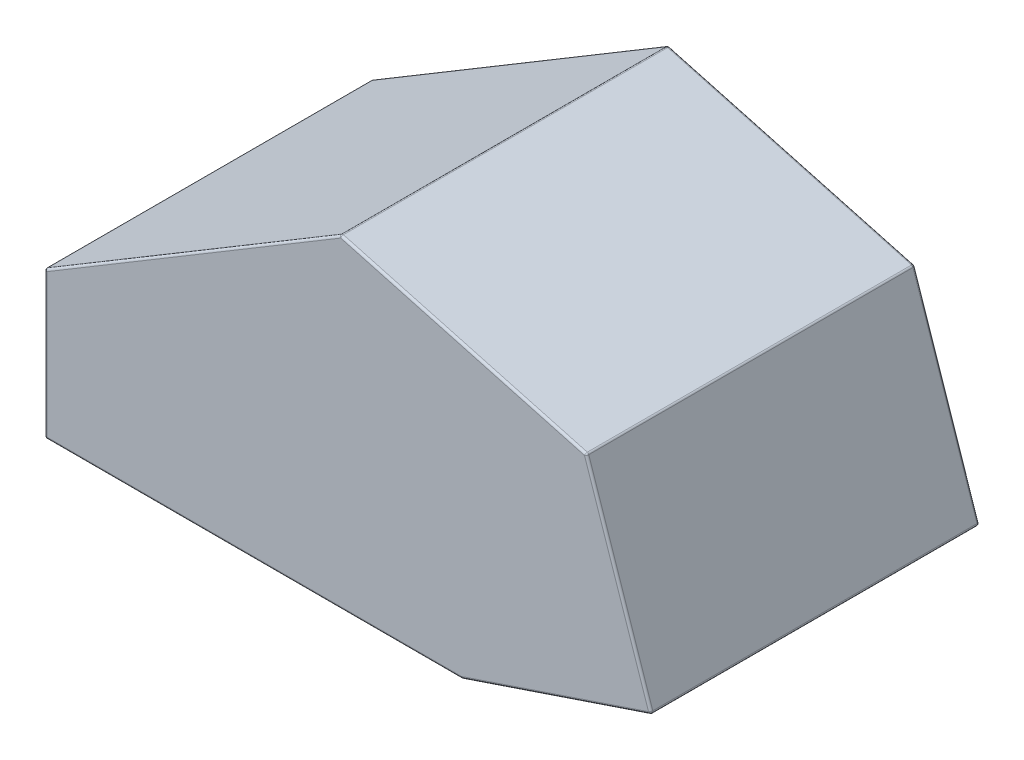
ISO-10303-21;
HEADER;
FILE_DESCRIPTION(('STEP AP214'),'2;1');
FILE_NAME('part.step','',(''),(''),'','','');
FILE_SCHEMA(('AUTOMOTIVE_DESIGN { 1 0 10303 214 1 1 1 1 }'));
ENDSEC;
DATA;
#1=APPLICATION_CONTEXT('core data for automotive mechanical design processes');
#2=APPLICATION_PROTOCOL_DEFINITION('international standard','automotive_design',2000,#1);
#3=PRODUCT_CONTEXT('',#1,'mechanical');
#4=PRODUCT('Part','Part','',(#3));
#5=PRODUCT_RELATED_PRODUCT_CATEGORY('part','',(#4));
#6=PRODUCT_DEFINITION_FORMATION('','',#4);
#7=PRODUCT_DEFINITION_CONTEXT('part definition',#1,'design');
#8=PRODUCT_DEFINITION('design','',#6,#7);
#9=PRODUCT_DEFINITION_SHAPE('','',#8);
#10=(LENGTH_UNIT() NAMED_UNIT(*) SI_UNIT(.MILLI.,.METRE.));
#11=(NAMED_UNIT(*) PLANE_ANGLE_UNIT() SI_UNIT($,.RADIAN.));
#12=(NAMED_UNIT(*) SI_UNIT($,.STERADIAN.) SOLID_ANGLE_UNIT());
#13=UNCERTAINTY_MEASURE_WITH_UNIT(LENGTH_MEASURE(1.E-05),#10,'distance_accuracy_value','');
#14=(GEOMETRIC_REPRESENTATION_CONTEXT(3) GLOBAL_UNCERTAINTY_ASSIGNED_CONTEXT((#13)) GLOBAL_UNIT_ASSIGNED_CONTEXT((#10,
#11,#12)) REPRESENTATION_CONTEXT('',''));
#15=CARTESIAN_POINT('',(0.,0.,0.));
#16=DIRECTION('',(0.,0.,1.));
#17=DIRECTION('',(1.,0.,0.));
#18=AXIS2_PLACEMENT_3D('',#15,#16,#17);
#19=CARTESIAN_POINT('',(424.852995024936,246.325755666636,-19.05));
#20=DIRECTION('',(0.947600978560582,0.31945639049959,0.));
#21=DIRECTION('',(-0.31945639049959,0.947600978560582,0.));
#22=AXIS2_PLACEMENT_3D('',#19,#20,#21);
#23=PLANE('',#22);
#24=DIRECTION('',(0.,0.,1.));
#25=VECTOR('',#24,1.);
#26=CARTESIAN_POINT('',(424.771853101749,246.56644631519,-19.05));
#27=LINE('',#26,#25);
#28=CARTESIAN_POINT('',(424.771853101749,246.56644631519,18.796));
#29=VERTEX_POINT('',#28);
#30=CARTESIAN_POINT('',(424.771853101749,246.56644631519,-18.796));
#31=VERTEX_POINT('',#30);
#32=EDGE_CURVE('E188',#29,#31,#27,.F.);
#33=ORIENTED_EDGE('',*,*,#32,.T.);
#34=DIRECTION('',(-0.31945639049959,0.947600978560582,0.));
#35=VECTOR('',#34,1.);
#36=CARTESIAN_POINT('',(424.852995024936,246.325755666636,-18.796));
#37=LINE('',#36,#35);
#38=CARTESIAN_POINT('',(417.351853621064,268.5763324152,-18.796));
#39=VERTEX_POINT('',#38);
#40=EDGE_CURVE('E162',#31,#39,#37,.T.);
#41=ORIENTED_EDGE('',*,*,#40,.T.);
#42=DIRECTION('',(0.,0.,1.));
#43=VECTOR('',#42,1.);
#44=CARTESIAN_POINT('',(417.351853621064,268.5763324152,-19.05));
#45=LINE('',#44,#43);
#46=CARTESIAN_POINT('',(417.351853621064,268.5763324152,18.796));
#47=VERTEX_POINT('',#46);
#48=EDGE_CURVE('E179',#39,#47,#45,.T.);
#49=ORIENTED_EDGE('',*,*,#48,.T.);
#50=DIRECTION('',(-0.31945639049959,0.947600978560582,0.));
#51=VECTOR('',#50,1.);
#52=CARTESIAN_POINT('',(424.852995024936,246.325755666636,18.796));
#53=LINE('',#52,#51);
#54=EDGE_CURVE('E185',#47,#29,#53,.F.);
#55=ORIENTED_EDGE('',*,*,#54,.T.);
#56=EDGE_LOOP('',(#33,#41,#49,#55));
#57=FACE_BOUND('',#56,.T.);
#58=ADVANCED_FACE('F33',(#57),#23,.T.);
#59=CARTESIAN_POINT('',(402.896942525742,238.923904634711,-19.05));
#60=DIRECTION('',(0.319456390499589,-0.947600978560583,0.));
#61=DIRECTION('',(0.947600978560583,0.31945639049959,0.));
#62=AXIS2_PLACEMENT_3D('',#59,#60,#61);
#63=PLANE('',#62);
#64=DIRECTION('',(0.947600978560583,0.31945639049959,0.));
#65=VECTOR('',#64,1.);
#66=CARTESIAN_POINT('',(402.896942525742,238.923904634711,-18.796));
#67=LINE('',#66,#65);
#68=CARTESIAN_POINT('',(402.936421950255,238.937213986156,-18.796));
#69=VERTEX_POINT('',#68);
#70=CARTESIAN_POINT('',(424.612304376382,246.244613743449,-18.796));
#71=VERTEX_POINT('',#70);
#72=EDGE_CURVE('E205',#69,#71,#67,.T.);
#73=ORIENTED_EDGE('',*,*,#72,.T.);
#74=DIRECTION('',(0.,0.,1.));
#75=VECTOR('',#74,1.);
#76=CARTESIAN_POINT('',(424.612304376382,246.244613743449,-19.05));
#77=LINE('',#76,#75);
#78=CARTESIAN_POINT('',(424.612304376382,246.244613743449,18.796));
#79=VERTEX_POINT('',#78);
#80=EDGE_CURVE('E211',#71,#79,#77,.T.);
#81=ORIENTED_EDGE('',*,*,#80,.T.);
#82=DIRECTION('',(0.947600978560583,0.31945639049959,0.));
#83=VECTOR('',#82,1.);
#84=CARTESIAN_POINT('',(402.896942525742,238.923904634711,18.796));
#85=LINE('',#84,#83);
#86=CARTESIAN_POINT('',(402.936421950255,238.937213986156,18.796));
#87=VERTEX_POINT('',#86);
#88=EDGE_CURVE('E209',#79,#87,#85,.F.);
#89=ORIENTED_EDGE('',*,*,#88,.T.);
#90=DIRECTION('',(0.,0.,1.));
#91=VECTOR('',#90,1.);
#92=CARTESIAN_POINT('',(402.936421950255,238.937213986156,-19.05));
#93=LINE('',#92,#91);
#94=EDGE_CURVE('E207',#87,#69,#93,.F.);
#95=ORIENTED_EDGE('',*,*,#94,.T.);
#96=EDGE_LOOP('',(#73,#81,#89,#95));
#97=FACE_BOUND('',#96,.T.);
#98=ADVANCED_FACE('F456',(#97),#63,.T.);
#99=CARTESIAN_POINT('',(354.511506684143,238.923904634711,-19.05));
#100=DIRECTION('',(0.,-1.,0.));
#101=DIRECTION('',(0.,0.,-1.));
#102=AXIS2_PLACEMENT_3D('',#99,#100,#101);
#103=PLANE('',#102);
#104=DIRECTION('',(1.,0.,0.));
#105=VECTOR('',#104,1.);
#106=CARTESIAN_POINT('',(354.511506684143,238.923904634711,18.796));
#107=LINE('',#106,#105);
#108=CARTESIAN_POINT('',(402.855280027068,238.923904634711,18.796));
#109=VERTEX_POINT('',#108);
#110=CARTESIAN_POINT('',(354.765506684143,238.923904634711,18.796));
#111=VERTEX_POINT('',#110);
#112=EDGE_CURVE('E227',#109,#111,#107,.F.);
#113=ORIENTED_EDGE('',*,*,#112,.T.);
#114=DIRECTION('',(0.,0.,1.));
#115=VECTOR('',#114,1.);
#116=CARTESIAN_POINT('',(354.765506684143,238.923904634711,-19.05));
#117=LINE('',#116,#115);
#118=CARTESIAN_POINT('',(354.765506684143,238.923904634711,-18.796));
#119=VERTEX_POINT('',#118);
#120=EDGE_CURVE('E229',#111,#119,#117,.F.);
#121=ORIENTED_EDGE('',*,*,#120,.T.);
#122=DIRECTION('',(1.,0.,0.));
#123=VECTOR('',#122,1.);
#124=CARTESIAN_POINT('',(354.511506684143,238.923904634711,-18.796));
#125=LINE('',#124,#123);
#126=CARTESIAN_POINT('',(402.855280027068,238.923904634711,-18.796));
#127=VERTEX_POINT('',#126);
#128=EDGE_CURVE('E223',#119,#127,#125,.T.);
#129=ORIENTED_EDGE('',*,*,#128,.T.);
#130=DIRECTION('',(0.,0.,1.));
#131=VECTOR('',#130,1.);
#132=CARTESIAN_POINT('',(402.855280027068,238.923904634711,-19.05));
#133=LINE('',#132,#131);
#134=EDGE_CURVE('E225',#127,#109,#133,.T.);
#135=ORIENTED_EDGE('',*,*,#134,.T.);
#136=EDGE_LOOP('',(#113,#121,#129,#135));
#137=FACE_BOUND('',#136,.T.);
#138=ADVANCED_FACE('F363',(#137),#103,.T.);
#139=CARTESIAN_POINT('',(354.511506684143,255.928673381803,-19.05));
#140=DIRECTION('',(-1.,0.,0.));
#141=DIRECTION('',(0.,0.,1.));
#142=AXIS2_PLACEMENT_3D('',#139,#140,#141);
#143=PLANE('',#142);
#144=DIRECTION('',(0.,0.,1.));
#145=VECTOR('',#144,1.);
#146=CARTESIAN_POINT('',(354.511506684143,255.784738849906,-19.05));
#147=LINE('',#146,#145);
#148=CARTESIAN_POINT('',(354.511506684143,255.784738849906,18.796));
#149=VERTEX_POINT('',#148);
#150=CARTESIAN_POINT('',(354.511506684143,255.784738849906,-18.796));
#151=VERTEX_POINT('',#150);
#152=EDGE_CURVE('E216',#149,#151,#147,.F.);
#153=ORIENTED_EDGE('',*,*,#152,.T.);
#154=DIRECTION('',(0.,-1.,0.));
#155=VECTOR('',#154,1.);
#156=CARTESIAN_POINT('',(354.511506684143,255.928673381803,-18.796));
#157=LINE('',#156,#155);
#158=CARTESIAN_POINT('',(354.511506684143,239.177904634711,-18.796));
#159=VERTEX_POINT('',#158);
#160=EDGE_CURVE('E220',#151,#159,#157,.T.);
#161=ORIENTED_EDGE('',*,*,#160,.T.);
#162=DIRECTION('',(0.,0.,1.));
#163=VECTOR('',#162,1.);
#164=CARTESIAN_POINT('',(354.511506684143,239.177904634711,-19.05));
#165=LINE('',#164,#163);
#166=CARTESIAN_POINT('',(354.511506684143,239.177904634711,18.796));
#167=VERTEX_POINT('',#166);
#168=EDGE_CURVE('E218',#159,#167,#165,.T.);
#169=ORIENTED_EDGE('',*,*,#168,.T.);
#170=DIRECTION('',(0.,-1.,0.));
#171=VECTOR('',#170,1.);
#172=CARTESIAN_POINT('',(354.511506684143,255.928673381803,18.796));
#173=LINE('',#172,#171);
#174=EDGE_CURVE('E214',#167,#149,#173,.F.);
#175=ORIENTED_EDGE('',*,*,#174,.T.);
#176=EDGE_LOOP('',(#153,#161,#169,#175));
#177=FACE_BOUND('',#176,.T.);
#178=ADVANCED_FACE('F383',(#177),#143,.T.);
#179=CARTESIAN_POINT('',(388.793340161436,276.463831058795,-19.05));
#180=DIRECTION('',(-0.513871079491551,0.857867421961102,0.));
#181=DIRECTION('',(-0.857867421961102,-0.513871079491551,0.));
#182=AXIS2_PLACEMENT_3D('',#179,#180,#181);
#183=PLANE('',#182);
#184=DIRECTION('',(0.,0.,1.));
#185=VECTOR('',#184,1.);
#186=CARTESIAN_POINT('',(388.70052465153,276.408233649396,-19.05));
#187=LINE('',#186,#185);
#188=CARTESIAN_POINT('',(388.70052465153,276.408233649396,18.796));
#189=VERTEX_POINT('',#188);
#190=CARTESIAN_POINT('',(388.70052465153,276.408233649396,-18.796));
#191=VERTEX_POINT('',#190);
#192=EDGE_CURVE('E232',#189,#191,#187,.F.);
#193=ORIENTED_EDGE('',*,*,#192,.T.);
#194=DIRECTION('',(-0.857867421961102,-0.513871079491551,0.));
#195=VECTOR('',#194,1.);
#196=CARTESIAN_POINT('',(388.793340161436,276.463831058795,-18.796));
#197=LINE('',#196,#195);
#198=CARTESIAN_POINT('',(354.634983429952,256.002637175084,-18.796));
#199=VERTEX_POINT('',#198);
#200=EDGE_CURVE('E238',#191,#199,#197,.T.);
#201=ORIENTED_EDGE('',*,*,#200,.T.);
#202=DIRECTION('',(0.,0.,1.));
#203=VECTOR('',#202,1.);
#204=CARTESIAN_POINT('',(354.634983429952,256.002637175084,-19.05));
#205=LINE('',#204,#203);
#206=CARTESIAN_POINT('',(354.634983429952,256.002637175084,18.796));
#207=VERTEX_POINT('',#206);
#208=EDGE_CURVE('E236',#199,#207,#205,.T.);
#209=ORIENTED_EDGE('',*,*,#208,.T.);
#210=DIRECTION('',(-0.857867421961102,-0.513871079491551,0.));
#211=VECTOR('',#210,1.);
#212=CARTESIAN_POINT('',(388.793340161436,276.463831058795,18.796));
#213=LINE('',#212,#211);
#214=EDGE_CURVE('E234',#207,#189,#213,.F.);
#215=ORIENTED_EDGE('',*,*,#214,.T.);
#216=EDGE_LOOP('',(#193,#201,#209,#215));
#217=FACE_BOUND('',#216,.T.);
#218=ADVANCED_FACE('F433',(#217),#183,.T.);
#219=CARTESIAN_POINT('',(417.308575131902,268.704709057211,-19.05));
#220=DIRECTION('',(0.262557985263458,0.964916216245946,0.));
#221=DIRECTION('',(-0.964916216245946,0.262557985263458,0.));
#222=AXIS2_PLACEMENT_3D('',#219,#220,#221);
#223=PLANE('',#222);
#224=DIRECTION('',(-0.964916216245946,0.262557985263458,0.));
#225=VECTOR('',#224,1.);
#226=CARTESIAN_POINT('',(417.308575131902,268.704709057211,-18.796));
#227=LINE('',#226,#225);
#228=CARTESIAN_POINT('',(417.177852700767,268.74027921094,-18.796));
#229=VERTEX_POINT('',#228);
#230=CARTESIAN_POINT('',(388.897737633977,276.435424043144,-18.796));
#231=VERTEX_POINT('',#230);
#232=EDGE_CURVE('E53',#229,#231,#227,.T.);
#233=ORIENTED_EDGE('',*,*,#232,.T.);
#234=DIRECTION('',(0.,0.,1.));
#235=VECTOR('',#234,1.);
#236=CARTESIAN_POINT('',(388.897737633977,276.435424043144,-19.05));
#237=LINE('',#236,#235);
#238=CARTESIAN_POINT('',(388.897737633977,276.435424043144,18.796));
#239=VERTEX_POINT('',#238);
#240=EDGE_CURVE('E11',#231,#239,#237,.T.);
#241=ORIENTED_EDGE('',*,*,#240,.T.);
#242=DIRECTION('',(-0.964916216245946,0.262557985263458,0.));
#243=VECTOR('',#242,1.);
#244=CARTESIAN_POINT('',(417.308575131902,268.704709057211,18.796));
#245=LINE('',#244,#243);
#246=CARTESIAN_POINT('',(417.177852700767,268.74027921094,18.796));
#247=VERTEX_POINT('',#246);
#248=EDGE_CURVE('E42',#239,#247,#245,.F.);
#249=ORIENTED_EDGE('',*,*,#248,.T.);
#250=DIRECTION('',(0.,0.,1.));
#251=VECTOR('',#250,1.);
#252=CARTESIAN_POINT('',(417.177852700767,268.74027921094,-19.05));
#253=LINE('',#252,#251);
#254=EDGE_CURVE('E254',#247,#229,#253,.F.);
#255=ORIENTED_EDGE('',*,*,#254,.T.);
#256=EDGE_LOOP('',(#233,#241,#249,#255));
#257=FACE_BOUND('',#256,.T.);
#258=ADVANCED_FACE('F479',(#257),#223,.T.);
#259=CARTESIAN_POINT('',(0.,0.,-19.05));
#260=DIRECTION('',(0.,0.,-1.));
#261=DIRECTION('',(-1.,0.,0.));
#262=AXIS2_PLACEMENT_3D('',#259,#260,#261);
#263=PLANE('',#262);
#264=DIRECTION('',(0.,-1.,0.));
#265=VECTOR('',#264,1.);
#266=CARTESIAN_POINT('',(354.765506684143,0.,-19.05));
#267=LINE('',#266,#265);
#268=CARTESIAN_POINT('',(354.765506684143,239.177904634711,-19.05));
#269=VERTEX_POINT('',#268);
#270=CARTESIAN_POINT('',(354.765506684143,255.784738849906,-19.05));
#271=VERTEX_POINT('',#270);
#272=EDGE_CURVE('E198',#269,#271,#267,.F.);
#273=ORIENTED_EDGE('',*,*,#272,.T.);
#274=DIRECTION('',(-0.857867421961102,-0.513871079491551,0.));
#275=VECTOR('',#274,1.);
#276=CARTESIAN_POINT('',(-19.0778032934777,31.8488947544007,-19.05));
#277=LINE('',#276,#275);
#278=CARTESIAN_POINT('',(388.83104790572,276.190335324217,-19.05));
#279=VERTEX_POINT('',#278);
#280=EDGE_CURVE('E203',#271,#279,#277,.F.);
#281=ORIENTED_EDGE('',*,*,#280,.T.);
#282=DIRECTION('',(-0.964916216245946,0.262557985263458,0.));
#283=VECTOR('',#282,1.);
#284=CARTESIAN_POINT('',(96.7765707006439,355.659654868322,-19.05));
#285=LINE('',#284,#283);
#286=CARTESIAN_POINT('',(417.11116297251,268.495190492013,-19.05));
#287=VERTEX_POINT('',#286);
#288=EDGE_CURVE('E201',#279,#287,#285,.F.);
#289=ORIENTED_EDGE('',*,*,#288,.T.);
#290=DIRECTION('',(-0.31945639049959,0.947600978560582,0.));
#291=VECTOR('',#290,1.);
#292=CARTESIAN_POINT('',(455.822082924261,153.667293107042,-19.05));
#293=LINE('',#292,#291);
#294=CARTESIAN_POINT('',(424.531162453195,246.485304392003,-19.05));
#295=VERTEX_POINT('',#294);
#296=EDGE_CURVE('E164',#287,#295,#293,.F.);
#297=ORIENTED_EDGE('',*,*,#296,.T.);
#298=DIRECTION('',(0.947600978560583,0.31945639049959,0.));
#299=VECTOR('',#298,1.);
#300=CARTESIAN_POINT('',(-31.2909204710664,92.8180112849612,-19.05));
#301=LINE('',#300,#299);
#302=CARTESIAN_POINT('',(402.855280027068,239.177904634711,-19.05));
#303=VERTEX_POINT('',#302);
#304=EDGE_CURVE('E190',#295,#303,#301,.F.);
#305=ORIENTED_EDGE('',*,*,#304,.T.);
#306=DIRECTION('',(1.,0.,0.));
#307=VECTOR('',#306,1.);
#308=CARTESIAN_POINT('',(0.,239.177904634711,-19.05));
#309=LINE('',#308,#307);
#310=EDGE_CURVE('E192',#303,#269,#309,.F.);
#311=ORIENTED_EDGE('',*,*,#310,.T.);
#312=EDGE_LOOP('',(#273,#281,#289,#297,#305,#311));
#313=FACE_BOUND('',#312,.T.);
#314=ADVANCED_FACE('F449',(#313),#263,.T.);
#315=CARTESIAN_POINT('',(0.,0.,19.05));
#316=DIRECTION('',(0.,0.,-1.));
#317=DIRECTION('',(-1.,0.,0.));
#318=AXIS2_PLACEMENT_3D('',#315,#316,#317);
#319=PLANE('',#318);
#320=DIRECTION('',(1.,0.,0.));
#321=VECTOR('',#320,1.);
#322=CARTESIAN_POINT('',(402.896942525742,239.177904634711,19.05));
#323=LINE('',#322,#321);
#324=CARTESIAN_POINT('',(354.765506684143,239.177904634711,19.05));
#325=VERTEX_POINT('',#324);
#326=CARTESIAN_POINT('',(402.855280027068,239.177904634711,19.05));
#327=VERTEX_POINT('',#326);
#328=EDGE_CURVE('E249',#325,#327,#323,.T.);
#329=ORIENTED_EDGE('',*,*,#328,.T.);
#330=DIRECTION('',(0.947600978560583,0.31945639049959,0.));
#331=VECTOR('',#330,1.);
#332=CARTESIAN_POINT('',(424.77185310175,246.56644631519,19.05));
#333=LINE('',#332,#331);
#334=CARTESIAN_POINT('',(424.531162453195,246.485304392003,19.05));
#335=VERTEX_POINT('',#334);
#336=EDGE_CURVE('E251',#327,#335,#333,.T.);
#337=ORIENTED_EDGE('',*,*,#336,.T.);
#338=DIRECTION('',(-0.31945639049959,0.947600978560582,0.));
#339=VECTOR('',#338,1.);
#340=CARTESIAN_POINT('',(417.067884483347,268.623567134024,19.05));
#341=LINE('',#340,#339);
#342=CARTESIAN_POINT('',(417.11116297251,268.495190492013,19.05));
#343=VERTEX_POINT('',#342);
#344=EDGE_CURVE('E241',#335,#343,#341,.T.);
#345=ORIENTED_EDGE('',*,*,#344,.T.);
#346=DIRECTION('',(-0.964916216245946,0.262557985263458,0.));
#347=VECTOR('',#346,1.);
#348=CARTESIAN_POINT('',(388.726650433179,276.218742339869,19.05));
#349=LINE('',#348,#347);
#350=CARTESIAN_POINT('',(388.83104790572,276.190335324217,19.05));
#351=VERTEX_POINT('',#350);
#352=EDGE_CURVE('E243',#343,#351,#349,.T.);
#353=ORIENTED_EDGE('',*,*,#352,.T.);
#354=DIRECTION('',(-0.857867421961102,-0.513871079491551,0.));
#355=VECTOR('',#354,1.);
#356=CARTESIAN_POINT('',(354.642029938334,255.710775056625,19.05));
#357=LINE('',#356,#355);
#358=CARTESIAN_POINT('',(354.765506684143,255.784738849906,19.05));
#359=VERTEX_POINT('',#358);
#360=EDGE_CURVE('E245',#351,#359,#357,.T.);
#361=ORIENTED_EDGE('',*,*,#360,.T.);
#362=DIRECTION('',(0.,-1.,0.));
#363=VECTOR('',#362,1.);
#364=CARTESIAN_POINT('',(354.765506684143,238.923904634711,19.05));
#365=LINE('',#364,#363);
#366=EDGE_CURVE('E247',#359,#325,#365,.T.);
#367=ORIENTED_EDGE('',*,*,#366,.T.);
#368=EDGE_LOOP('',(#329,#337,#345,#353,#361,#367));
#369=FACE_BOUND('',#368,.T.);
#370=ADVANCED_FACE('F371',(#369),#319,.F.);
#371=CARTESIAN_POINT('',(354.765506684143,0.,18.796));
#372=DIRECTION('',(0.,1.,0.));
#373=DIRECTION('',(0.,0.,1.));
#374=AXIS2_PLACEMENT_3D('',#371,#372,#373);
#375=CYLINDRICAL_SURFACE('',#374,0.254);
#376=CARTESIAN_POINT('',(354.765506684143,239.177904634711,18.796));
#377=DIRECTION('',(0.,-1.,0.));
#378=DIRECTION('',(0.,0.,-1.));
#379=AXIS2_PLACEMENT_3D('',#376,#377,#378);
#380=CIRCLE('',#379,0.254);
#381=EDGE_CURVE('E37',#325,#167,#380,.T.);
#382=ORIENTED_EDGE('',*,*,#381,.F.);
#383=ORIENTED_EDGE('',*,*,#366,.F.);
#384=CARTESIAN_POINT('',(354.765506684143,255.784738849906,18.796));
#385=DIRECTION('',(0.,1.,0.));
#386=DIRECTION('',(0.,0.,1.));
#387=AXIS2_PLACEMENT_3D('',#384,#385,#386);
#388=CIRCLE('',#387,0.254);
#389=EDGE_CURVE('E341',#149,#359,#388,.T.);
#390=ORIENTED_EDGE('',*,*,#389,.F.);
#391=ORIENTED_EDGE('',*,*,#174,.F.);
#392=EDGE_LOOP('',(#382,#383,#390,#391));
#393=FACE_BOUND('',#392,.T.);
#394=ADVANCED_FACE('F35',(#393),#375,.T.);
#395=CARTESIAN_POINT('',(354.765506684143,239.177904634711,18.796));
#396=DIRECTION('',(0.,0.,1.));
#397=DIRECTION('',(1.,0.,0.));
#398=AXIS2_PLACEMENT_3D('',#395,#396,#397);
#399=SPHERICAL_SURFACE('',#398,0.254);
#400=CARTESIAN_POINT('',(354.765506684143,239.177904634711,18.796));
#401=DIRECTION('',(-1.,0.,0.));
#402=DIRECTION('',(0.,0.,1.));
#403=AXIS2_PLACEMENT_3D('',#400,#401,#402);
#404=CIRCLE('',#403,0.254);
#405=EDGE_CURVE('E336',#325,#111,#404,.F.);
#406=ORIENTED_EDGE('',*,*,#405,.F.);
#407=ORIENTED_EDGE('',*,*,#381,.T.);
#408=CARTESIAN_POINT('',(354.765506684143,239.177904634711,18.796));
#409=DIRECTION('',(0.,0.,1.));
#410=DIRECTION('',(1.,0.,0.));
#411=AXIS2_PLACEMENT_3D('',#408,#409,#410);
#412=CIRCLE('',#411,0.254);
#413=EDGE_CURVE('E339',#111,#167,#412,.F.);
#414=ORIENTED_EDGE('',*,*,#413,.F.);
#415=EDGE_LOOP('',(#406,#407,#414));
#416=FACE_BOUND('',#415,.T.);
#417=ADVANCED_FACE('F352',(#416),#399,.T.);
#418=CARTESIAN_POINT('',(354.765506684143,255.784738849906,18.796));
#419=DIRECTION('',(0.,0.,1.));
#420=DIRECTION('',(1.,0.,0.));
#421=AXIS2_PLACEMENT_3D('',#418,#419,#420);
#422=SPHERICAL_SURFACE('',#421,0.254);
#423=CARTESIAN_POINT('',(354.765506684143,255.784738849906,18.796));
#424=DIRECTION('',(0.,0.,1.));
#425=DIRECTION('',(1.,0.,0.));
#426=AXIS2_PLACEMENT_3D('',#423,#424,#425);
#427=CIRCLE('',#426,0.254);
#428=EDGE_CURVE('E330',#149,#207,#427,.F.);
#429=ORIENTED_EDGE('',*,*,#428,.F.);
#430=ORIENTED_EDGE('',*,*,#389,.T.);
#431=CARTESIAN_POINT('',(354.765506684143,255.784738849906,18.796));
#432=DIRECTION('',(-0.857867421961127,-0.513871079491511,0.));
#433=DIRECTION('',(0.513871079491511,-0.857867421961127,0.));
#434=AXIS2_PLACEMENT_3D('',#431,#432,#433);
#435=CIRCLE('',#434,0.254);
#436=EDGE_CURVE('E333',#207,#359,#435,.F.);
#437=ORIENTED_EDGE('',*,*,#436,.F.);
#438=EDGE_LOOP('',(#429,#430,#437));
#439=FACE_BOUND('',#438,.T.);
#440=ADVANCED_FACE('F375',(#439),#422,.T.);
#441=CARTESIAN_POINT('',(354.765506684143,239.177904634711,-19.05));
#442=DIRECTION('',(0.,0.,1.));
#443=DIRECTION('',(1.,0.,0.));
#444=AXIS2_PLACEMENT_3D('',#441,#442,#443);
#445=CYLINDRICAL_SURFACE('',#444,0.254);
#446=ORIENTED_EDGE('',*,*,#413,.T.);
#447=ORIENTED_EDGE('',*,*,#168,.F.);
#448=CARTESIAN_POINT('',(354.765506684143,239.177904634711,-18.796));
#449=DIRECTION('',(0.,0.,-1.));
#450=DIRECTION('',(-1.,0.,0.));
#451=AXIS2_PLACEMENT_3D('',#448,#449,#450);
#452=CIRCLE('',#451,0.254);
#453=EDGE_CURVE('E325',#119,#159,#452,.T.);
#454=ORIENTED_EDGE('',*,*,#453,.F.);
#455=ORIENTED_EDGE('',*,*,#120,.F.);
#456=EDGE_LOOP('',(#446,#447,#454,#455));
#457=FACE_BOUND('',#456,.T.);
#458=ADVANCED_FACE('F360',(#457),#445,.T.);
#459=CARTESIAN_POINT('',(0.,239.177904634711,18.796));
#460=DIRECTION('',(-1.,0.,0.));
#461=DIRECTION('',(0.,0.,1.));
#462=AXIS2_PLACEMENT_3D('',#459,#460,#461);
#463=CYLINDRICAL_SURFACE('',#462,0.254);
#464=ORIENTED_EDGE('',*,*,#405,.T.);
#465=ORIENTED_EDGE('',*,*,#112,.F.);
#466=CARTESIAN_POINT('',(402.855280027068,239.177904634711,18.796));
#467=DIRECTION('',(1.,0.,0.));
#468=DIRECTION('',(0.,0.,-1.));
#469=AXIS2_PLACEMENT_3D('',#466,#467,#468);
#470=CIRCLE('',#469,0.254);
#471=EDGE_CURVE('E322',#327,#109,#470,.T.);
#472=ORIENTED_EDGE('',*,*,#471,.F.);
#473=ORIENTED_EDGE('',*,*,#328,.F.);
#474=EDGE_LOOP('',(#464,#465,#472,#473));
#475=FACE_BOUND('',#474,.T.);
#476=ADVANCED_FACE('F368',(#475),#463,.T.);
#477=CARTESIAN_POINT('',(-19.0778032934777,31.8488947544007,18.796));
#478=DIRECTION('',(0.857867421961102,0.513871079491551,0.));
#479=DIRECTION('',(-0.513871079491551,0.857867421961102,0.));
#480=AXIS2_PLACEMENT_3D('',#477,#478,#479);
#481=CYLINDRICAL_SURFACE('',#480,0.254);
#482=ORIENTED_EDGE('',*,*,#436,.T.);
#483=ORIENTED_EDGE('',*,*,#360,.F.);
#484=CARTESIAN_POINT('',(388.83104790572,276.190335324217,18.796));
#485=DIRECTION('',(0.857867421961127,0.513871079491511,-1.87485071641154E-13));
#486=DIRECTION('',(-0.513871079491511,0.857867421961127,0.));
#487=AXIS2_PLACEMENT_3D('',#484,#485,#486);
#488=CIRCLE('',#487,0.254);
#489=EDGE_CURVE('E319',#189,#351,#488,.T.);
#490=ORIENTED_EDGE('',*,*,#489,.F.);
#491=ORIENTED_EDGE('',*,*,#214,.F.);
#492=EDGE_LOOP('',(#482,#483,#490,#491));
#493=FACE_BOUND('',#492,.T.);
#494=ADVANCED_FACE('F431',(#493),#481,.T.);
#495=CARTESIAN_POINT('',(354.765506684143,255.784738849906,-19.05));
#496=DIRECTION('',(0.,0.,1.));
#497=DIRECTION('',(1.,0.,0.));
#498=AXIS2_PLACEMENT_3D('',#495,#496,#497);
#499=CYLINDRICAL_SURFACE('',#498,0.254);
#500=ORIENTED_EDGE('',*,*,#428,.T.);
#501=ORIENTED_EDGE('',*,*,#208,.F.);
#502=CARTESIAN_POINT('',(354.765506684143,255.784738849906,-18.796));
#503=DIRECTION('',(0.,0.,-1.));
#504=DIRECTION('',(-1.,0.,0.));
#505=AXIS2_PLACEMENT_3D('',#502,#503,#504);
#506=CIRCLE('',#505,0.254);
#507=EDGE_CURVE('E316',#151,#199,#506,.T.);
#508=ORIENTED_EDGE('',*,*,#507,.F.);
#509=ORIENTED_EDGE('',*,*,#152,.F.);
#510=EDGE_LOOP('',(#500,#501,#508,#509));
#511=FACE_BOUND('',#510,.T.);
#512=ADVANCED_FACE('F380',(#511),#499,.T.);
#513=CARTESIAN_POINT('',(354.765506684143,255.928673381803,-18.796));
#514=DIRECTION('',(0.,-1.,0.));
#515=DIRECTION('',(0.,0.,-1.));
#516=AXIS2_PLACEMENT_3D('',#513,#514,#515);
#517=CYLINDRICAL_SURFACE('',#516,0.254);
#518=CARTESIAN_POINT('',(354.765506684143,239.177904634711,-18.796));
#519=DIRECTION('',(0.,-1.,0.));
#520=DIRECTION('',(0.,0.,-1.));
#521=AXIS2_PLACEMENT_3D('',#518,#519,#520);
#522=CIRCLE('',#521,0.254);
#523=EDGE_CURVE('E327',#159,#269,#522,.T.);
#524=ORIENTED_EDGE('',*,*,#523,.F.);
#525=ORIENTED_EDGE('',*,*,#160,.F.);
#526=CARTESIAN_POINT('',(354.765506684143,255.784738849906,-18.796));
#527=DIRECTION('',(0.,1.,0.));
#528=DIRECTION('',(0.,0.,1.));
#529=AXIS2_PLACEMENT_3D('',#526,#527,#528);
#530=CIRCLE('',#529,0.254);
#531=EDGE_CURVE('E313',#271,#151,#530,.T.);
#532=ORIENTED_EDGE('',*,*,#531,.F.);
#533=ORIENTED_EDGE('',*,*,#272,.F.);
#534=EDGE_LOOP('',(#524,#525,#532,#533));
#535=FACE_BOUND('',#534,.T.);
#536=ADVANCED_FACE('F387',(#535),#517,.T.);
#537=CARTESIAN_POINT('',(354.765506684143,239.177904634711,-18.796));
#538=DIRECTION('',(0.,0.,1.));
#539=DIRECTION('',(1.,0.,0.));
#540=AXIS2_PLACEMENT_3D('',#537,#538,#539);
#541=SPHERICAL_SURFACE('',#540,0.254);
#542=ORIENTED_EDGE('',*,*,#453,.T.);
#543=ORIENTED_EDGE('',*,*,#523,.T.);
#544=CARTESIAN_POINT('',(354.765506684143,239.177904634711,-18.796));
#545=DIRECTION('',(-1.,0.,0.));
#546=DIRECTION('',(0.,0.,1.));
#547=AXIS2_PLACEMENT_3D('',#544,#545,#546);
#548=CIRCLE('',#547,0.254);
#549=EDGE_CURVE('E310',#119,#269,#548,.F.);
#550=ORIENTED_EDGE('',*,*,#549,.F.);
#551=EDGE_LOOP('',(#542,#543,#550));
#552=FACE_BOUND('',#551,.T.);
#553=ADVANCED_FACE('F392',(#552),#541,.T.);
#554=CARTESIAN_POINT('',(402.855280027068,239.177904634711,18.796));
#555=DIRECTION('',(0.,0.,1.));
#556=DIRECTION('',(1.,0.,0.));
#557=AXIS2_PLACEMENT_3D('',#554,#555,#556);
#558=SPHERICAL_SURFACE('',#557,0.254);
#559=CARTESIAN_POINT('',(402.855280027068,239.177904634711,18.796));
#560=DIRECTION('',(-0.947600978560552,-0.319456390499679,0.));
#561=DIRECTION('',(0.319456390499679,-0.947600978560552,0.));
#562=AXIS2_PLACEMENT_3D('',#559,#560,#561);
#563=CIRCLE('',#562,0.254);
#564=EDGE_CURVE('E304',#327,#87,#563,.F.);
#565=ORIENTED_EDGE('',*,*,#564,.F.);
#566=ORIENTED_EDGE('',*,*,#471,.T.);
#567=CARTESIAN_POINT('',(402.855280027068,239.177904634711,18.796));
#568=DIRECTION('',(0.,0.,1.));
#569=DIRECTION('',(1.,0.,0.));
#570=AXIS2_PLACEMENT_3D('',#567,#568,#569);
#571=CIRCLE('',#570,0.254);
#572=EDGE_CURVE('E307',#87,#109,#571,.F.);
#573=ORIENTED_EDGE('',*,*,#572,.F.);
#574=EDGE_LOOP('',(#565,#566,#573));
#575=FACE_BOUND('',#574,.T.);
#576=ADVANCED_FACE('F407',(#575),#558,.T.);
#577=CARTESIAN_POINT('',(388.83104790572,276.190335324217,18.796));
#578=DIRECTION('',(0.,0.,1.));
#579=DIRECTION('',(1.,0.,0.));
#580=AXIS2_PLACEMENT_3D('',#577,#578,#579);
#581=SPHERICAL_SURFACE('',#580,0.254);
#582=CARTESIAN_POINT('',(388.83104790572,276.190335324217,18.796));
#583=DIRECTION('',(0.,0.,1.));
#584=DIRECTION('',(1.,0.,0.));
#585=AXIS2_PLACEMENT_3D('',#582,#583,#584);
#586=CIRCLE('',#585,0.254);
#587=EDGE_CURVE('E299',#189,#239,#586,.F.);
#588=ORIENTED_EDGE('',*,*,#587,.F.);
#589=ORIENTED_EDGE('',*,*,#489,.T.);
#590=CARTESIAN_POINT('',(388.83104790572,276.190335324217,18.796));
#591=DIRECTION('',(-0.964916216246014,0.262557985263208,0.));
#592=DIRECTION('',(-0.262557985263208,-0.964916216246014,0.));
#593=AXIS2_PLACEMENT_3D('',#590,#591,#592);
#594=CIRCLE('',#593,0.254);
#595=EDGE_CURVE('E301',#239,#351,#594,.F.);
#596=ORIENTED_EDGE('',*,*,#595,.F.);
#597=EDGE_LOOP('',(#588,#589,#596));
#598=FACE_BOUND('',#597,.T.);
#599=ADVANCED_FACE('F427',(#598),#581,.T.);
#600=CARTESIAN_POINT('',(354.765506684143,255.784738849906,-18.796));
#601=DIRECTION('',(0.,0.,1.));
#602=DIRECTION('',(1.,0.,0.));
#603=AXIS2_PLACEMENT_3D('',#600,#601,#602);
#604=SPHERICAL_SURFACE('',#603,0.254);
#605=ORIENTED_EDGE('',*,*,#531,.T.);
#606=ORIENTED_EDGE('',*,*,#507,.T.);
#607=CARTESIAN_POINT('',(354.765506684143,255.784738849906,-18.796));
#608=DIRECTION('',(-0.857867421961127,-0.513871079491511,0.));
#609=DIRECTION('',(0.513871079491511,-0.857867421961127,0.));
#610=AXIS2_PLACEMENT_3D('',#607,#608,#609);
#611=CIRCLE('',#610,0.254);
#612=EDGE_CURVE('E297',#271,#199,#611,.F.);
#613=ORIENTED_EDGE('',*,*,#612,.F.);
#614=EDGE_LOOP('',(#605,#606,#613));
#615=FACE_BOUND('',#614,.T.);
#616=ADVANCED_FACE('F609',(#615),#604,.T.);
#617=CARTESIAN_POINT('',(354.511506684143,239.177904634711,-18.796));
#618=DIRECTION('',(1.,0.,0.));
#619=DIRECTION('',(0.,0.,-1.));
#620=AXIS2_PLACEMENT_3D('',#617,#618,#619);
#621=CYLINDRICAL_SURFACE('',#620,0.254);
#622=ORIENTED_EDGE('',*,*,#549,.T.);
#623=ORIENTED_EDGE('',*,*,#310,.F.);
#624=CARTESIAN_POINT('',(402.855280027068,239.177904634711,-18.796));
#625=DIRECTION('',(1.,0.,0.));
#626=DIRECTION('',(0.,0.,-1.));
#627=AXIS2_PLACEMENT_3D('',#624,#625,#626);
#628=CIRCLE('',#627,0.254);
#629=EDGE_CURVE('E294',#127,#303,#628,.T.);
#630=ORIENTED_EDGE('',*,*,#629,.F.);
#631=ORIENTED_EDGE('',*,*,#128,.F.);
#632=EDGE_LOOP('',(#622,#623,#630,#631));
#633=FACE_BOUND('',#632,.T.);
#634=ADVANCED_FACE('F395',(#633),#621,.T.);
#635=CARTESIAN_POINT('',(402.855280027068,239.177904634711,-19.05));
#636=DIRECTION('',(0.,0.,1.));
#637=DIRECTION('',(1.,0.,0.));
#638=AXIS2_PLACEMENT_3D('',#635,#636,#637);
#639=CYLINDRICAL_SURFACE('',#638,0.254);
#640=ORIENTED_EDGE('',*,*,#572,.T.);
#641=ORIENTED_EDGE('',*,*,#134,.F.);
#642=CARTESIAN_POINT('',(402.855280027068,239.177904634711,-18.796));
#643=DIRECTION('',(0.,0.,-1.));
#644=DIRECTION('',(-1.,0.,0.));
#645=AXIS2_PLACEMENT_3D('',#642,#643,#644);
#646=CIRCLE('',#645,0.254);
#647=EDGE_CURVE('E291',#69,#127,#646,.T.);
#648=ORIENTED_EDGE('',*,*,#647,.F.);
#649=ORIENTED_EDGE('',*,*,#94,.F.);
#650=EDGE_LOOP('',(#640,#641,#648,#649));
#651=FACE_BOUND('',#650,.T.);
#652=ADVANCED_FACE('F404',(#651),#639,.T.);
#653=CARTESIAN_POINT('',(-31.2909204710664,92.8180112849612,18.796));
#654=DIRECTION('',(-0.947600978560583,-0.31945639049959,0.));
#655=DIRECTION('',(0.31945639049959,-0.947600978560583,0.));
#656=AXIS2_PLACEMENT_3D('',#653,#654,#655);
#657=CYLINDRICAL_SURFACE('',#656,0.254);
#658=ORIENTED_EDGE('',*,*,#564,.T.);
#659=ORIENTED_EDGE('',*,*,#88,.F.);
#660=CARTESIAN_POINT('',(424.531162453195,246.485304392003,18.796));
#661=DIRECTION('',(0.94760097856063,0.31945639049945,0.));
#662=DIRECTION('',(-0.31945639049945,0.94760097856063,0.));
#663=AXIS2_PLACEMENT_3D('',#660,#661,#662);
#664=CIRCLE('',#663,0.254);
#665=EDGE_CURVE('E288',#335,#79,#664,.T.);
#666=ORIENTED_EDGE('',*,*,#665,.F.);
#667=ORIENTED_EDGE('',*,*,#336,.F.);
#668=EDGE_LOOP('',(#658,#659,#666,#667));
#669=FACE_BOUND('',#668,.T.);
#670=ADVANCED_FACE('F411',(#669),#657,.T.);
#671=CARTESIAN_POINT('',(455.822082924261,153.667293107042,18.796));
#672=DIRECTION('',(0.31945639049959,-0.947600978560582,0.));
#673=DIRECTION('',(0.947600978560582,0.31945639049959,0.));
#674=AXIS2_PLACEMENT_3D('',#671,#672,#673);
#675=CYLINDRICAL_SURFACE('',#674,0.254);
#676=CARTESIAN_POINT('',(417.11116297251,268.495190492013,18.796));
#677=DIRECTION('',(-0.319456390499516,0.947600978560608,0.));
#678=DIRECTION('',(-0.947600978560608,-0.319456390499516,0.));
#679=AXIS2_PLACEMENT_3D('',#676,#677,#678);
#680=CIRCLE('',#679,0.254);
#681=EDGE_CURVE('E283',#343,#47,#680,.T.);
#682=ORIENTED_EDGE('',*,*,#681,.F.);
#683=ORIENTED_EDGE('',*,*,#344,.F.);
#684=CARTESIAN_POINT('',(424.531162453195,246.485304392003,18.796));
#685=DIRECTION('',(0.319456390499614,-0.947600978560574,0.));
#686=DIRECTION('',(0.947600978560574,0.319456390499614,0.));
#687=AXIS2_PLACEMENT_3D('',#684,#685,#686);
#688=CIRCLE('',#687,0.254);
#689=EDGE_CURVE('E286',#29,#335,#688,.T.);
#690=ORIENTED_EDGE('',*,*,#689,.F.);
#691=ORIENTED_EDGE('',*,*,#54,.F.);
#692=EDGE_LOOP('',(#682,#683,#690,#691));
#693=FACE_BOUND('',#692,.T.);
#694=ADVANCED_FACE('F418',(#693),#675,.T.);
#695=CARTESIAN_POINT('',(96.7765707006439,355.659654868322,18.796));
#696=DIRECTION('',(0.964916216245946,-0.262557985263458,0.));
#697=DIRECTION('',(0.262557985263458,0.964916216245946,0.));
#698=AXIS2_PLACEMENT_3D('',#695,#696,#697);
#699=CYLINDRICAL_SURFACE('',#698,0.254);
#700=ORIENTED_EDGE('',*,*,#595,.T.);
#701=ORIENTED_EDGE('',*,*,#352,.F.);
#702=CARTESIAN_POINT('',(417.11116297251,268.495190492013,18.796));
#703=DIRECTION('',(0.964916216245959,-0.262557985263412,0.));
#704=DIRECTION('',(0.262557985263412,0.964916216245959,0.));
#705=AXIS2_PLACEMENT_3D('',#702,#703,#704);
#706=CIRCLE('',#705,0.254);
#707=EDGE_CURVE('E280',#247,#343,#706,.T.);
#708=ORIENTED_EDGE('',*,*,#707,.F.);
#709=ORIENTED_EDGE('',*,*,#248,.F.);
#710=EDGE_LOOP('',(#700,#701,#708,#709));
#711=FACE_BOUND('',#710,.T.);
#712=ADVANCED_FACE('F422',(#711),#699,.T.);
#713=CARTESIAN_POINT('',(388.83104790572,276.190335324217,-19.05));
#714=DIRECTION('',(0.,0.,1.));
#715=DIRECTION('',(1.,0.,0.));
#716=AXIS2_PLACEMENT_3D('',#713,#714,#715);
#717=CYLINDRICAL_SURFACE('',#716,0.254);
#718=ORIENTED_EDGE('',*,*,#587,.T.);
#719=ORIENTED_EDGE('',*,*,#240,.F.);
#720=CARTESIAN_POINT('',(388.83104790572,276.190335324217,-18.796));
#721=DIRECTION('',(0.,0.,-1.));
#722=DIRECTION('',(-1.,0.,0.));
#723=AXIS2_PLACEMENT_3D('',#720,#721,#722);
#724=CIRCLE('',#723,0.254);
#725=EDGE_CURVE('E277',#191,#231,#724,.T.);
#726=ORIENTED_EDGE('',*,*,#725,.F.);
#727=ORIENTED_EDGE('',*,*,#192,.F.);
#728=EDGE_LOOP('',(#718,#719,#726,#727));
#729=FACE_BOUND('',#728,.T.);
#730=ADVANCED_FACE('F442',(#729),#717,.T.);
#731=CARTESIAN_POINT('',(388.923863415627,276.245932733617,-18.796));
#732=DIRECTION('',(-0.857867421961102,-0.513871079491551,0.));
#733=DIRECTION('',(0.513871079491551,-0.857867421961102,0.));
#734=AXIS2_PLACEMENT_3D('',#731,#732,#733);
#735=CYLINDRICAL_SURFACE('',#734,0.254);
#736=ORIENTED_EDGE('',*,*,#612,.T.);
#737=ORIENTED_EDGE('',*,*,#200,.F.);
#738=CARTESIAN_POINT('',(388.83104790572,276.190335324217,-18.796));
#739=DIRECTION('',(0.857867421961127,0.513871079491511,0.));
#740=DIRECTION('',(-0.513871079491511,0.857867421961127,0.));
#741=AXIS2_PLACEMENT_3D('',#738,#739,#740);
#742=CIRCLE('',#741,0.254);
#743=EDGE_CURVE('E274',#279,#191,#742,.T.);
#744=ORIENTED_EDGE('',*,*,#743,.F.);
#745=ORIENTED_EDGE('',*,*,#280,.F.);
#746=EDGE_LOOP('',(#736,#737,#744,#745));
#747=FACE_BOUND('',#746,.T.);
#748=ADVANCED_FACE('F438',(#747),#735,.T.);
#749=CARTESIAN_POINT('',(402.855280027068,239.177904634711,-18.796));
#750=DIRECTION('',(0.,0.,1.));
#751=DIRECTION('',(1.,0.,0.));
#752=AXIS2_PLACEMENT_3D('',#749,#750,#751);
#753=SPHERICAL_SURFACE('',#752,0.254);
#754=ORIENTED_EDGE('',*,*,#647,.T.);
#755=ORIENTED_EDGE('',*,*,#629,.T.);
#756=CARTESIAN_POINT('',(402.855280027068,239.177904634711,-18.796));
#757=DIRECTION('',(-0.947600978560552,-0.319456390499679,0.));
#758=DIRECTION('',(0.319456390499679,-0.947600978560552,0.));
#759=AXIS2_PLACEMENT_3D('',#756,#757,#758);
#760=CIRCLE('',#759,0.254);
#761=EDGE_CURVE('E271',#69,#303,#760,.F.);
#762=ORIENTED_EDGE('',*,*,#761,.F.);
#763=EDGE_LOOP('',(#754,#755,#762));
#764=FACE_BOUND('',#763,.T.);
#765=ADVANCED_FACE('F400',(#764),#753,.T.);
#766=CARTESIAN_POINT('',(424.531162453195,246.485304392003,18.796));
#767=DIRECTION('',(0.,0.,1.));
#768=DIRECTION('',(1.,0.,0.));
#769=AXIS2_PLACEMENT_3D('',#766,#767,#768);
#770=SPHERICAL_SURFACE('',#769,0.254);
#771=ORIENTED_EDGE('',*,*,#689,.T.);
#772=ORIENTED_EDGE('',*,*,#665,.T.);
#773=CARTESIAN_POINT('',(424.531162453195,246.485304392003,18.796));
#774=DIRECTION('',(0.,0.,1.));
#775=DIRECTION('',(1.,0.,0.));
#776=AXIS2_PLACEMENT_3D('',#773,#774,#775);
#777=CIRCLE('',#776,0.254);
#778=EDGE_CURVE('E269',#29,#79,#777,.F.);
#779=ORIENTED_EDGE('',*,*,#778,.F.);
#780=EDGE_LOOP('',(#771,#772,#779));
#781=FACE_BOUND('',#780,.T.);
#782=ADVANCED_FACE('F460',(#781),#770,.T.);
#783=CARTESIAN_POINT('',(417.11116297251,268.495190492013,18.796));
#784=DIRECTION('',(0.,0.,1.));
#785=DIRECTION('',(1.,0.,0.));
#786=AXIS2_PLACEMENT_3D('',#783,#784,#785);
#787=SPHERICAL_SURFACE('',#786,0.254);
#788=ORIENTED_EDGE('',*,*,#707,.T.);
#789=ORIENTED_EDGE('',*,*,#681,.T.);
#790=CARTESIAN_POINT('',(417.11116297251,268.495190492013,18.796));
#791=DIRECTION('',(0.,0.,1.));
#792=DIRECTION('',(1.,0.,0.));
#793=AXIS2_PLACEMENT_3D('',#790,#791,#792);
#794=CIRCLE('',#793,0.254);
#795=EDGE_CURVE('E182',#247,#47,#794,.F.);
#796=ORIENTED_EDGE('',*,*,#795,.F.);
#797=EDGE_LOOP('',(#788,#789,#796));
#798=FACE_BOUND('',#797,.T.);
#799=ADVANCED_FACE('F462',(#798),#787,.T.);
#800=CARTESIAN_POINT('',(388.83104790572,276.190335324217,-18.796));
#801=DIRECTION('',(0.,0.,1.));
#802=DIRECTION('',(1.,0.,0.));
#803=AXIS2_PLACEMENT_3D('',#800,#801,#802);
#804=SPHERICAL_SURFACE('',#803,0.254);
#805=ORIENTED_EDGE('',*,*,#743,.T.);
#806=ORIENTED_EDGE('',*,*,#725,.T.);
#807=CARTESIAN_POINT('',(388.83104790572,276.190335324217,-18.796));
#808=DIRECTION('',(-0.964916216245959,0.262557985263412,0.));
#809=DIRECTION('',(-0.262557985263412,-0.964916216245959,0.));
#810=AXIS2_PLACEMENT_3D('',#807,#808,#809);
#811=CIRCLE('',#810,0.254);
#812=EDGE_CURVE('E265',#279,#231,#811,.F.);
#813=ORIENTED_EDGE('',*,*,#812,.F.);
#814=EDGE_LOOP('',(#805,#806,#813));
#815=FACE_BOUND('',#814,.T.);
#816=ADVANCED_FACE('F444',(#815),#804,.T.);
#817=CARTESIAN_POINT('',(402.815800602555,239.164595283265,-18.796));
#818=DIRECTION('',(0.947600978560583,0.31945639049959,0.));
#819=DIRECTION('',(-0.31945639049959,0.947600978560583,0.));
#820=AXIS2_PLACEMENT_3D('',#817,#818,#819);
#821=CYLINDRICAL_SURFACE('',#820,0.254);
#822=ORIENTED_EDGE('',*,*,#761,.T.);
#823=ORIENTED_EDGE('',*,*,#304,.F.);
#824=CARTESIAN_POINT('',(424.531162453195,246.485304392003,-18.796));
#825=DIRECTION('',(0.947600978560552,0.319456390499679,0.));
#826=DIRECTION('',(-0.319456390499679,0.947600978560552,0.));
#827=AXIS2_PLACEMENT_3D('',#824,#825,#826);
#828=CIRCLE('',#827,0.254);
#829=EDGE_CURVE('E262',#71,#295,#828,.T.);
#830=ORIENTED_EDGE('',*,*,#829,.F.);
#831=ORIENTED_EDGE('',*,*,#72,.F.);
#832=EDGE_LOOP('',(#822,#823,#830,#831));
#833=FACE_BOUND('',#832,.T.);
#834=ADVANCED_FACE('F453',(#833),#821,.T.);
#835=CARTESIAN_POINT('',(424.531162453195,246.485304392003,-19.05));
#836=DIRECTION('',(0.,0.,1.));
#837=DIRECTION('',(1.,0.,0.));
#838=AXIS2_PLACEMENT_3D('',#835,#836,#837);
#839=CYLINDRICAL_SURFACE('',#838,0.254);
#840=ORIENTED_EDGE('',*,*,#778,.T.);
#841=ORIENTED_EDGE('',*,*,#80,.F.);
#842=CARTESIAN_POINT('',(424.531162453195,246.485304392003,-18.796));
#843=DIRECTION('',(0.,0.,-1.));
#844=DIRECTION('',(-1.,0.,0.));
#845=AXIS2_PLACEMENT_3D('',#842,#843,#844);
#846=CIRCLE('',#845,0.254);
#847=EDGE_CURVE('E176',#31,#71,#846,.T.);
#848=ORIENTED_EDGE('',*,*,#847,.F.);
#849=ORIENTED_EDGE('',*,*,#32,.F.);
#850=EDGE_LOOP('',(#840,#841,#848,#849));
#851=FACE_BOUND('',#850,.T.);
#852=ADVANCED_FACE('F458',(#851),#839,.T.);
#853=CARTESIAN_POINT('',(417.11116297251,268.495190492013,-19.05));
#854=DIRECTION('',(0.,0.,1.));
#855=DIRECTION('',(1.,0.,0.));
#856=AXIS2_PLACEMENT_3D('',#853,#854,#855);
#857=CYLINDRICAL_SURFACE('',#856,0.254);
#858=ORIENTED_EDGE('',*,*,#795,.T.);
#859=ORIENTED_EDGE('',*,*,#48,.F.);
#860=CARTESIAN_POINT('',(417.11116297251,268.495190492013,-18.796));
#861=DIRECTION('',(0.,0.,-1.));
#862=DIRECTION('',(-1.,0.,0.));
#863=AXIS2_PLACEMENT_3D('',#860,#861,#862);
#864=CIRCLE('',#863,0.254);
#865=EDGE_CURVE('E170',#229,#39,#864,.T.);
#866=ORIENTED_EDGE('',*,*,#865,.F.);
#867=ORIENTED_EDGE('',*,*,#254,.F.);
#868=EDGE_LOOP('',(#858,#859,#866,#867));
#869=FACE_BOUND('',#868,.T.);
#870=ADVANCED_FACE('F180',(#869),#857,.T.);
#871=CARTESIAN_POINT('',(417.241885403645,268.459620338284,-18.796));
#872=DIRECTION('',(-0.964916216245946,0.262557985263458,0.));
#873=DIRECTION('',(-0.262557985263458,-0.964916216245946,0.));
#874=AXIS2_PLACEMENT_3D('',#871,#872,#873);
#875=CYLINDRICAL_SURFACE('',#874,0.254);
#876=ORIENTED_EDGE('',*,*,#812,.T.);
#877=ORIENTED_EDGE('',*,*,#232,.F.);
#878=CARTESIAN_POINT('',(417.11116297251,268.495190492013,-18.796));
#879=DIRECTION('',(0.964916216245959,-0.262557985263412,0.));
#880=DIRECTION('',(0.262557985263412,0.964916216245959,0.));
#881=AXIS2_PLACEMENT_3D('',#878,#879,#880);
#882=CIRCLE('',#881,0.254);
#883=EDGE_CURVE('E174',#287,#229,#882,.T.);
#884=ORIENTED_EDGE('',*,*,#883,.F.);
#885=ORIENTED_EDGE('',*,*,#288,.F.);
#886=EDGE_LOOP('',(#876,#877,#884,#885));
#887=FACE_BOUND('',#886,.T.);
#888=ADVANCED_FACE('F447',(#887),#875,.T.);
#889=CARTESIAN_POINT('',(424.531162453195,246.485304392003,-18.796));
#890=DIRECTION('',(0.,0.,1.));
#891=DIRECTION('',(1.,0.,0.));
#892=AXIS2_PLACEMENT_3D('',#889,#890,#891);
#893=SPHERICAL_SURFACE('',#892,0.254);
#894=ORIENTED_EDGE('',*,*,#847,.T.);
#895=ORIENTED_EDGE('',*,*,#829,.T.);
#896=CARTESIAN_POINT('',(424.531162453195,246.485304392003,-18.796));
#897=DIRECTION('',(0.319456390499614,-0.947600978560574,0.));
#898=DIRECTION('',(0.947600978560574,0.319456390499614,0.));
#899=AXIS2_PLACEMENT_3D('',#896,#897,#898);
#900=CIRCLE('',#899,0.254);
#901=EDGE_CURVE('E167',#31,#295,#900,.F.);
#902=ORIENTED_EDGE('',*,*,#901,.F.);
#903=EDGE_LOOP('',(#894,#895,#902));
#904=FACE_BOUND('',#903,.T.);
#905=ADVANCED_FACE('F485',(#904),#893,.T.);
#906=CARTESIAN_POINT('',(417.11116297251,268.495190492013,-18.796));
#907=DIRECTION('',(0.,0.,1.));
#908=DIRECTION('',(1.,0.,0.));
#909=AXIS2_PLACEMENT_3D('',#906,#907,#908);
#910=SPHERICAL_SURFACE('',#909,0.254);
#911=ORIENTED_EDGE('',*,*,#883,.T.);
#912=ORIENTED_EDGE('',*,*,#865,.T.);
#913=CARTESIAN_POINT('',(417.11116297251,268.495190492013,-18.796));
#914=DIRECTION('',(-0.319456390499712,0.947600978560541,0.));
#915=DIRECTION('',(-0.947600978560541,-0.319456390499712,0.));
#916=AXIS2_PLACEMENT_3D('',#913,#914,#915);
#917=CIRCLE('',#916,0.254);
#918=EDGE_CURVE('E158',#287,#39,#917,.F.);
#919=ORIENTED_EDGE('',*,*,#918,.F.);
#920=EDGE_LOOP('',(#911,#912,#919));
#921=FACE_BOUND('',#920,.T.);
#922=ADVANCED_FACE('F172',(#921),#910,.T.);
#923=CARTESIAN_POINT('',(424.612304376382,246.244613743449,-18.796));
#924=DIRECTION('',(-0.31945639049959,0.947600978560582,0.));
#925=DIRECTION('',(-0.947600978560582,-0.31945639049959,0.));
#926=AXIS2_PLACEMENT_3D('',#923,#924,#925);
#927=CYLINDRICAL_SURFACE('',#926,0.254);
#928=ORIENTED_EDGE('',*,*,#901,.T.);
#929=ORIENTED_EDGE('',*,*,#296,.F.);
#930=ORIENTED_EDGE('',*,*,#918,.T.);
#931=ORIENTED_EDGE('',*,*,#40,.F.);
#932=EDGE_LOOP('',(#928,#929,#930,#931));
#933=FACE_BOUND('',#932,.T.);
#934=ADVANCED_FACE('F160',(#933),#927,.T.);
#935=CLOSED_SHELL('',(#58,#98,#138,#178,#218,#258,#314,#370,#394,#417,#440,#458,#476,#494,#512,
#536,#553,#576,#599,#616,#634,#652,#670,#694,#712,#730,#748,#765,#782,#799,#816,#834,#852,#870,
#888,#905,#922,#934));
#936=MANIFOLD_SOLID_BREP('B2',#935);
#937=ADVANCED_BREP_SHAPE_REPRESENTATION('',(#18,#936),#14);
#938=SHAPE_DEFINITION_REPRESENTATION(#9,#937);
ENDSEC;
END-ISO-10303-21;
